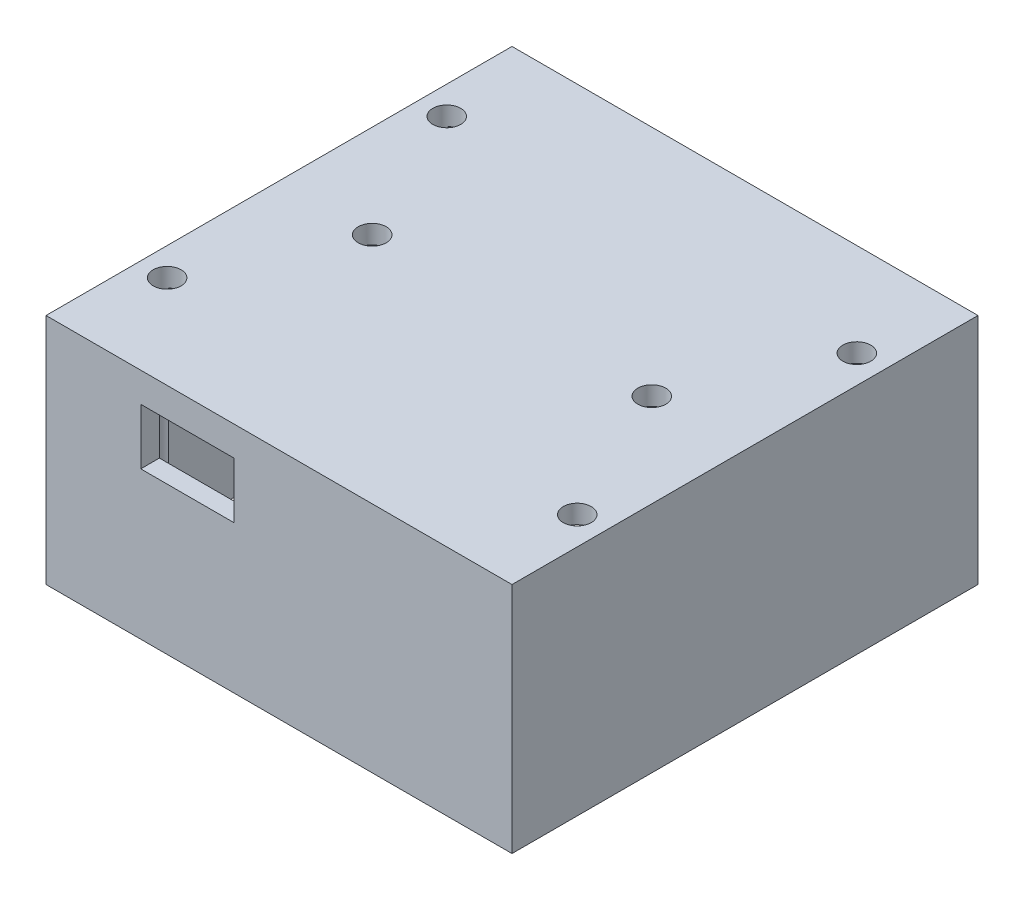
ISO-10303-21;
HEADER;
FILE_DESCRIPTION(('STEP AP214'),'2;1');
FILE_NAME('part.step','',(''),(''),'','','');
FILE_SCHEMA(('AUTOMOTIVE_DESIGN { 1 0 10303 214 1 1 1 1 }'));
ENDSEC;
DATA;
#1=APPLICATION_CONTEXT('core data for automotive mechanical design processes');
#2=APPLICATION_PROTOCOL_DEFINITION('international standard','automotive_design',2000,#1);
#3=PRODUCT_CONTEXT('',#1,'mechanical');
#4=PRODUCT('Part','Part','',(#3));
#5=PRODUCT_RELATED_PRODUCT_CATEGORY('part','',(#4));
#6=PRODUCT_DEFINITION_FORMATION('','',#4);
#7=PRODUCT_DEFINITION_CONTEXT('part definition',#1,'design');
#8=PRODUCT_DEFINITION('design','',#6,#7);
#9=PRODUCT_DEFINITION_SHAPE('','',#8);
#10=(LENGTH_UNIT() NAMED_UNIT(*) SI_UNIT(.MILLI.,.METRE.));
#11=(NAMED_UNIT(*) PLANE_ANGLE_UNIT() SI_UNIT($,.RADIAN.));
#12=(NAMED_UNIT(*) SI_UNIT($,.STERADIAN.) SOLID_ANGLE_UNIT());
#13=UNCERTAINTY_MEASURE_WITH_UNIT(LENGTH_MEASURE(1.E-05),#10,'distance_accuracy_value','');
#14=(GEOMETRIC_REPRESENTATION_CONTEXT(3) GLOBAL_UNCERTAINTY_ASSIGNED_CONTEXT((#13)) GLOBAL_UNIT_ASSIGNED_CONTEXT((#10,
#11,#12)) REPRESENTATION_CONTEXT('',''));
#15=CARTESIAN_POINT('',(0.,0.,0.));
#16=DIRECTION('',(0.,0.,1.));
#17=DIRECTION('',(1.,0.,0.));
#18=AXIS2_PLACEMENT_3D('',#15,#16,#17);
#19=CARTESIAN_POINT('',(23.,25.,-25.));
#20=DIRECTION('',(-1.,0.,0.));
#21=DIRECTION('',(0.,0.,1.));
#22=AXIS2_PLACEMENT_3D('',#19,#20,#21);
#23=PLANE('',#22);
#24=DIRECTION('',(0.,1.,0.));
#25=VECTOR('',#24,1.);
#26=CARTESIAN_POINT('',(23.,0.,-13.8819660112501));
#27=LINE('',#26,#25);
#28=CARTESIAN_POINT('',(23.,0.,-13.8819660112501));
#29=VERTEX_POINT('',#28);
#30=CARTESIAN_POINT('',(23.,23.,-13.8819660112501));
#31=VERTEX_POINT('',#30);
#32=EDGE_CURVE('E270',#29,#31,#27,.T.);
#33=ORIENTED_EDGE('',*,*,#32,.F.);
#34=DIRECTION('',(0.,0.,-1.));
#35=VECTOR('',#34,1.);
#36=CARTESIAN_POINT('',(23.,0.,-25.));
#37=LINE('',#36,#35);
#38=CARTESIAN_POINT('',(23.,0.,13.8819660112502));
#39=VERTEX_POINT('',#38);
#40=EDGE_CURVE('E294',#39,#29,#37,.T.);
#41=ORIENTED_EDGE('',*,*,#40,.F.);
#42=DIRECTION('',(0.,1.,0.));
#43=VECTOR('',#42,1.);
#44=CARTESIAN_POINT('',(23.,0.,13.8819660112502));
#45=LINE('',#44,#43);
#46=CARTESIAN_POINT('',(23.,23.,13.8819660112502));
#47=VERTEX_POINT('',#46);
#48=EDGE_CURVE('E188',#47,#39,#45,.F.);
#49=ORIENTED_EDGE('',*,*,#48,.F.);
#50=DIRECTION('',(0.,0.,-1.));
#51=VECTOR('',#50,1.);
#52=CARTESIAN_POINT('',(23.,23.,-25.));
#53=LINE('',#52,#51);
#54=EDGE_CURVE('E261',#47,#31,#53,.T.);
#55=ORIENTED_EDGE('',*,*,#54,.T.);
#56=EDGE_LOOP('',(#33,#41,#49,#55));
#57=FACE_BOUND('',#56,.T.);
#58=ADVANCED_FACE('F34',(#57),#23,.T.);
#59=DIRECTION('',(0.,1.,0.));
#60=VECTOR('',#59,1.);
#61=CARTESIAN_POINT('',(23.,0.,16.1180339887498));
#62=LINE('',#61,#60);
#63=CARTESIAN_POINT('',(23.,0.,16.1180339887498));
#64=VERTEX_POINT('',#63);
#65=CARTESIAN_POINT('',(23.,23.,16.1180339887498));
#66=VERTEX_POINT('',#65);
#67=EDGE_CURVE('E339',#64,#66,#62,.T.);
#68=ORIENTED_EDGE('',*,*,#67,.F.);
#69=CARTESIAN_POINT('',(23.,0.,23.));
#70=VERTEX_POINT('',#69);
#71=EDGE_CURVE('E205',#70,#64,#37,.T.);
#72=ORIENTED_EDGE('',*,*,#71,.F.);
#73=DIRECTION('',(0.,-1.,0.));
#74=VECTOR('',#73,1.);
#75=CARTESIAN_POINT('',(23.,25.,23.));
#76=LINE('',#75,#74);
#77=CARTESIAN_POINT('',(23.,23.,23.));
#78=VERTEX_POINT('',#77);
#79=EDGE_CURVE('E279',#78,#70,#76,.T.);
#80=ORIENTED_EDGE('',*,*,#79,.F.);
#81=EDGE_CURVE('E272',#78,#66,#53,.T.);
#82=ORIENTED_EDGE('',*,*,#81,.T.);
#83=EDGE_LOOP('',(#68,#72,#80,#82));
#84=FACE_BOUND('',#83,.T.);
#85=ADVANCED_FACE('F397',(#84),#23,.T.);
#86=CARTESIAN_POINT('',(-23.,25.,-25.));
#87=DIRECTION('',(1.,0.,0.));
#88=DIRECTION('',(0.,0.,-1.));
#89=AXIS2_PLACEMENT_3D('',#86,#87,#88);
#90=PLANE('',#89);
#91=DIRECTION('',(0.,1.,0.));
#92=VECTOR('',#91,1.);
#93=CARTESIAN_POINT('',(-23.,0.,-16.1180339887499));
#94=LINE('',#93,#92);
#95=CARTESIAN_POINT('',(-23.,0.,-16.1180339887499));
#96=VERTEX_POINT('',#95);
#97=CARTESIAN_POINT('',(-23.,23.,-16.1180339887499));
#98=VERTEX_POINT('',#97);
#99=EDGE_CURVE('E58',#96,#98,#94,.T.);
#100=ORIENTED_EDGE('',*,*,#99,.F.);
#101=DIRECTION('',(0.,0.,1.));
#102=VECTOR('',#101,1.);
#103=CARTESIAN_POINT('',(-23.,0.,-25.));
#104=LINE('',#103,#102);
#105=CARTESIAN_POINT('',(-23.,0.,-23.));
#106=VERTEX_POINT('',#105);
#107=EDGE_CURVE('E195',#106,#96,#104,.T.);
#108=ORIENTED_EDGE('',*,*,#107,.F.);
#109=DIRECTION('',(0.,-1.,0.));
#110=VECTOR('',#109,1.);
#111=CARTESIAN_POINT('',(-23.,25.,-23.));
#112=LINE('',#111,#110);
#113=CARTESIAN_POINT('',(-23.,23.,-23.));
#114=VERTEX_POINT('',#113);
#115=EDGE_CURVE('E283',#114,#106,#112,.T.);
#116=ORIENTED_EDGE('',*,*,#115,.F.);
#117=DIRECTION('',(0.,0.,1.));
#118=VECTOR('',#117,1.);
#119=CARTESIAN_POINT('',(-23.,23.,-25.));
#120=LINE('',#119,#118);
#121=EDGE_CURVE('E290',#114,#98,#120,.T.);
#122=ORIENTED_EDGE('',*,*,#121,.T.);
#123=EDGE_LOOP('',(#100,#108,#116,#122));
#124=FACE_BOUND('',#123,.T.);
#125=ADVANCED_FACE('F403',(#124),#90,.T.);
#126=DIRECTION('',(0.,1.,0.));
#127=VECTOR('',#126,1.);
#128=CARTESIAN_POINT('',(-23.,0.,-13.8819660112501));
#129=LINE('',#128,#127);
#130=CARTESIAN_POINT('',(-23.,23.,-13.8819660112501));
#131=VERTEX_POINT('',#130);
#132=CARTESIAN_POINT('',(-23.,0.,-13.8819660112501));
#133=VERTEX_POINT('',#132);
#134=EDGE_CURVE('E334',#131,#133,#129,.F.);
#135=ORIENTED_EDGE('',*,*,#134,.F.);
#136=CARTESIAN_POINT('',(-23.,23.,13.8819660112501));
#137=VERTEX_POINT('',#136);
#138=EDGE_CURVE('E187',#131,#137,#120,.T.);
#139=ORIENTED_EDGE('',*,*,#138,.T.);
#140=DIRECTION('',(0.,1.,0.));
#141=VECTOR('',#140,1.);
#142=CARTESIAN_POINT('',(-23.,0.,13.8819660112501));
#143=LINE('',#142,#141);
#144=CARTESIAN_POINT('',(-23.,0.,13.8819660112501));
#145=VERTEX_POINT('',#144);
#146=EDGE_CURVE('E50',#145,#137,#143,.T.);
#147=ORIENTED_EDGE('',*,*,#146,.F.);
#148=EDGE_CURVE('E185',#133,#145,#104,.T.);
#149=ORIENTED_EDGE('',*,*,#148,.F.);
#150=EDGE_LOOP('',(#135,#139,#147,#149));
#151=FACE_BOUND('',#150,.T.);
#152=ADVANCED_FACE('F184',(#151),#90,.T.);
#153=CARTESIAN_POINT('',(25.,25.,-25.));
#154=DIRECTION('',(-1.,0.,0.));
#155=DIRECTION('',(0.,0.,1.));
#156=AXIS2_PLACEMENT_3D('',#153,#154,#155);
#157=PLANE('',#156);
#158=DIRECTION('',(0.,0.,-1.));
#159=VECTOR('',#158,1.);
#160=CARTESIAN_POINT('',(25.,0.,-25.));
#161=LINE('',#160,#159);
#162=CARTESIAN_POINT('',(25.,0.,25.));
#163=VERTEX_POINT('',#162);
#164=CARTESIAN_POINT('',(25.,0.,-25.));
#165=VERTEX_POINT('',#164);
#166=EDGE_CURVE('E217',#163,#165,#161,.T.);
#167=ORIENTED_EDGE('',*,*,#166,.T.);
#168=DIRECTION('',(0.,-1.,0.));
#169=VECTOR('',#168,1.);
#170=CARTESIAN_POINT('',(25.,25.,-25.));
#171=LINE('',#170,#169);
#172=CARTESIAN_POINT('',(25.,25.,-25.));
#173=VERTEX_POINT('',#172);
#174=EDGE_CURVE('E234',#173,#165,#171,.T.);
#175=ORIENTED_EDGE('',*,*,#174,.F.);
#176=DIRECTION('',(0.,0.,-1.));
#177=VECTOR('',#176,1.);
#178=CARTESIAN_POINT('',(25.,25.,-25.));
#179=LINE('',#178,#177);
#180=CARTESIAN_POINT('',(25.,25.,25.));
#181=VERTEX_POINT('',#180);
#182=EDGE_CURVE('E206',#181,#173,#179,.T.);
#183=ORIENTED_EDGE('',*,*,#182,.F.);
#184=DIRECTION('',(0.,-1.,0.));
#185=VECTOR('',#184,1.);
#186=CARTESIAN_POINT('',(25.,25.,25.));
#187=LINE('',#186,#185);
#188=EDGE_CURVE('E216',#181,#163,#187,.T.);
#189=ORIENTED_EDGE('',*,*,#188,.T.);
#190=EDGE_LOOP('',(#167,#175,#183,#189));
#191=FACE_BOUND('',#190,.T.);
#192=ADVANCED_FACE('F36',(#191),#157,.F.);
#193=CARTESIAN_POINT('',(-25.,25.,-25.));
#194=DIRECTION('',(0.,0.,1.));
#195=DIRECTION('',(1.,0.,0.));
#196=AXIS2_PLACEMENT_3D('',#193,#194,#195);
#197=PLANE('',#196);
#198=DIRECTION('',(-1.,0.,0.));
#199=VECTOR('',#198,1.);
#200=CARTESIAN_POINT('',(-25.,0.,-25.));
#201=LINE('',#200,#199);
#202=CARTESIAN_POINT('',(-25.,0.,-25.));
#203=VERTEX_POINT('',#202);
#204=EDGE_CURVE('E220',#165,#203,#201,.T.);
#205=ORIENTED_EDGE('',*,*,#204,.T.);
#206=DIRECTION('',(0.,-1.,0.));
#207=VECTOR('',#206,1.);
#208=CARTESIAN_POINT('',(-25.,25.,-25.));
#209=LINE('',#208,#207);
#210=CARTESIAN_POINT('',(-25.,25.,-25.));
#211=VERTEX_POINT('',#210);
#212=EDGE_CURVE('E231',#211,#203,#209,.T.);
#213=ORIENTED_EDGE('',*,*,#212,.F.);
#214=DIRECTION('',(-1.,0.,0.));
#215=VECTOR('',#214,1.);
#216=CARTESIAN_POINT('',(-25.,25.,-25.));
#217=LINE('',#216,#215);
#218=EDGE_CURVE('E209',#173,#211,#217,.T.);
#219=ORIENTED_EDGE('',*,*,#218,.F.);
#220=ORIENTED_EDGE('',*,*,#174,.T.);
#221=EDGE_LOOP('',(#205,#213,#219,#220));
#222=FACE_BOUND('',#221,.T.);
#223=ADVANCED_FACE('F380',(#222),#197,.F.);
#224=CARTESIAN_POINT('',(-25.,25.,-25.));
#225=DIRECTION('',(1.,0.,0.));
#226=DIRECTION('',(0.,0.,-1.));
#227=AXIS2_PLACEMENT_3D('',#224,#225,#226);
#228=PLANE('',#227);
#229=DIRECTION('',(0.,0.,1.));
#230=VECTOR('',#229,1.);
#231=CARTESIAN_POINT('',(-25.,0.,-25.));
#232=LINE('',#231,#230);
#233=CARTESIAN_POINT('',(-25.,0.,25.));
#234=VERTEX_POINT('',#233);
#235=EDGE_CURVE('E223',#203,#234,#232,.T.);
#236=ORIENTED_EDGE('',*,*,#235,.T.);
#237=DIRECTION('',(0.,-1.,0.));
#238=VECTOR('',#237,1.);
#239=CARTESIAN_POINT('',(-25.,25.,25.));
#240=LINE('',#239,#238);
#241=CARTESIAN_POINT('',(-25.,25.,25.));
#242=VERTEX_POINT('',#241);
#243=EDGE_CURVE('E228',#242,#234,#240,.T.);
#244=ORIENTED_EDGE('',*,*,#243,.F.);
#245=DIRECTION('',(0.,0.,1.));
#246=VECTOR('',#245,1.);
#247=CARTESIAN_POINT('',(-25.,25.,-25.));
#248=LINE('',#247,#246);
#249=EDGE_CURVE('E212',#211,#242,#248,.T.);
#250=ORIENTED_EDGE('',*,*,#249,.F.);
#251=ORIENTED_EDGE('',*,*,#212,.T.);
#252=EDGE_LOOP('',(#236,#244,#250,#251));
#253=FACE_BOUND('',#252,.T.);
#254=ADVANCED_FACE('F385',(#253),#228,.F.);
#255=CARTESIAN_POINT('',(-25.,25.,25.));
#256=DIRECTION('',(0.,0.,-1.));
#257=DIRECTION('',(-1.,0.,0.));
#258=AXIS2_PLACEMENT_3D('',#255,#256,#257);
#259=PLANE('',#258);
#260=DIRECTION('',(-1.,0.,0.));
#261=VECTOR('',#260,1.);
#262=CARTESIAN_POINT('',(-14.8335821112489,21.831840126127,25.));
#263=LINE('',#262,#261);
#264=CARTESIAN_POINT('',(-4.83358211124892,21.831840126127,25.));
#265=VERTEX_POINT('',#264);
#266=CARTESIAN_POINT('',(-14.8335821112489,21.831840126127,25.));
#267=VERTEX_POINT('',#266);
#268=EDGE_CURVE('E325',#265,#267,#263,.T.);
#269=ORIENTED_EDGE('',*,*,#268,.F.);
#270=DIRECTION('',(0.,1.,0.));
#271=VECTOR('',#270,1.);
#272=CARTESIAN_POINT('',(-4.83358211124892,21.831840126127,25.));
#273=LINE('',#272,#271);
#274=CARTESIAN_POINT('',(-4.83358211124892,15.831840126127,25.));
#275=VERTEX_POINT('',#274);
#276=EDGE_CURVE('E329',#275,#265,#273,.T.);
#277=ORIENTED_EDGE('',*,*,#276,.F.);
#278=DIRECTION('',(1.,0.,0.));
#279=VECTOR('',#278,1.);
#280=CARTESIAN_POINT('',(-14.8335821112489,15.831840126127,25.));
#281=LINE('',#280,#279);
#282=CARTESIAN_POINT('',(-14.8335821112489,15.831840126127,25.));
#283=VERTEX_POINT('',#282);
#284=EDGE_CURVE('E311',#283,#275,#281,.T.);
#285=ORIENTED_EDGE('',*,*,#284,.F.);
#286=DIRECTION('',(0.,-1.,0.));
#287=VECTOR('',#286,1.);
#288=CARTESIAN_POINT('',(-14.8335821112489,21.831840126127,25.));
#289=LINE('',#288,#287);
#290=EDGE_CURVE('E320',#267,#283,#289,.T.);
#291=ORIENTED_EDGE('',*,*,#290,.F.);
#292=EDGE_LOOP('',(#269,#277,#285,#291));
#293=FACE_BOUND('',#292,.T.);
#294=DIRECTION('',(1.,0.,0.));
#295=VECTOR('',#294,1.);
#296=CARTESIAN_POINT('',(-25.,0.,25.));
#297=LINE('',#296,#295);
#298=EDGE_CURVE('E210',#234,#163,#297,.T.);
#299=ORIENTED_EDGE('',*,*,#298,.T.);
#300=ORIENTED_EDGE('',*,*,#188,.F.);
#301=DIRECTION('',(1.,0.,0.));
#302=VECTOR('',#301,1.);
#303=CARTESIAN_POINT('',(-25.,25.,25.));
#304=LINE('',#303,#302);
#305=EDGE_CURVE('E214',#242,#181,#304,.T.);
#306=ORIENTED_EDGE('',*,*,#305,.F.);
#307=ORIENTED_EDGE('',*,*,#243,.T.);
#308=EDGE_LOOP('',(#299,#300,#306,#307));
#309=FACE_BOUND('',#308,.T.);
#310=ADVANCED_FACE('F367',(#293,#309),#259,.F.);
#311=CARTESIAN_POINT('',(0.,25.,0.));
#312=DIRECTION('',(0.,1.,0.));
#313=DIRECTION('',(0.,0.,1.));
#314=AXIS2_PLACEMENT_3D('',#311,#312,#313);
#315=PLANE('',#314);
#316=CARTESIAN_POINT('',(-15.,25.,0.));
#317=DIRECTION('',(0.,1.,0.));
#318=DIRECTION('',(0.,0.,-1.));
#319=AXIS2_PLACEMENT_3D('',#316,#317,#318);
#320=CIRCLE('',#319,1.5);
#321=CARTESIAN_POINT('',(-15.,25.,-1.5));
#322=VERTEX_POINT('',#321);
#323=EDGE_CURVE('E345',#322,#322,#320,.T.);
#324=ORIENTED_EDGE('',*,*,#323,.F.);
#325=EDGE_LOOP('',(#324));
#326=FACE_BOUND('',#325,.T.);
#327=CARTESIAN_POINT('',(-22.,25.,-15.));
#328=DIRECTION('',(0.,1.,0.));
#329=DIRECTION('',(0.,0.,1.));
#330=AXIS2_PLACEMENT_3D('',#327,#328,#329);
#331=CIRCLE('',#330,1.5);
#332=CARTESIAN_POINT('',(-22.,25.,-13.5));
#333=VERTEX_POINT('',#332);
#334=EDGE_CURVE('E355',#333,#333,#331,.T.);
#335=ORIENTED_EDGE('',*,*,#334,.F.);
#336=EDGE_LOOP('',(#335));
#337=FACE_BOUND('',#336,.T.);
#338=CARTESIAN_POINT('',(22.,25.,-15.));
#339=DIRECTION('',(0.,1.,0.));
#340=DIRECTION('',(0.,0.,-1.));
#341=AXIS2_PLACEMENT_3D('',#338,#339,#340);
#342=CIRCLE('',#341,1.5);
#343=CARTESIAN_POINT('',(22.,25.,-16.5));
#344=VERTEX_POINT('',#343);
#345=EDGE_CURVE('E350',#344,#344,#342,.T.);
#346=ORIENTED_EDGE('',*,*,#345,.F.);
#347=EDGE_LOOP('',(#346));
#348=FACE_BOUND('',#347,.T.);
#349=CARTESIAN_POINT('',(21.9999999999999,25.,15.));
#350=DIRECTION('',(0.,1.,0.));
#351=DIRECTION('',(0.,0.,1.));
#352=AXIS2_PLACEMENT_3D('',#349,#350,#351);
#353=CIRCLE('',#352,1.5);
#354=CARTESIAN_POINT('',(21.9999999999999,25.,16.5));
#355=VERTEX_POINT('',#354);
#356=EDGE_CURVE('E177',#355,#355,#353,.T.);
#357=ORIENTED_EDGE('',*,*,#356,.F.);
#358=EDGE_LOOP('',(#357));
#359=FACE_BOUND('',#358,.T.);
#360=CARTESIAN_POINT('',(-22.,25.,15.));
#361=DIRECTION('',(0.,1.,0.));
#362=DIRECTION('',(0.,0.,-1.));
#363=AXIS2_PLACEMENT_3D('',#360,#361,#362);
#364=CIRCLE('',#363,1.5);
#365=CARTESIAN_POINT('',(-22.,25.,13.5));
#366=VERTEX_POINT('',#365);
#367=EDGE_CURVE('E178',#366,#366,#364,.T.);
#368=ORIENTED_EDGE('',*,*,#367,.F.);
#369=EDGE_LOOP('',(#368));
#370=FACE_BOUND('',#369,.T.);
#371=CARTESIAN_POINT('',(15.,25.,0.));
#372=DIRECTION('',(0.,1.,0.));
#373=DIRECTION('',(0.,0.,1.));
#374=AXIS2_PLACEMENT_3D('',#371,#372,#373);
#375=CIRCLE('',#374,1.5);
#376=CARTESIAN_POINT('',(15.,25.,1.5));
#377=VERTEX_POINT('',#376);
#378=EDGE_CURVE('E250',#377,#377,#375,.T.);
#379=ORIENTED_EDGE('',*,*,#378,.F.);
#380=EDGE_LOOP('',(#379));
#381=FACE_BOUND('',#380,.T.);
#382=ORIENTED_EDGE('',*,*,#182,.T.);
#383=ORIENTED_EDGE('',*,*,#218,.T.);
#384=ORIENTED_EDGE('',*,*,#249,.T.);
#385=ORIENTED_EDGE('',*,*,#305,.T.);
#386=EDGE_LOOP('',(#382,#383,#384,#385));
#387=FACE_BOUND('',#386,.T.);
#388=ADVANCED_FACE('F364',(#326,#337,#348,#359,#370,#381,#387),#315,.T.);
#389=CARTESIAN_POINT('',(0.,0.,0.));
#390=DIRECTION('',(0.,1.,0.));
#391=DIRECTION('',(0.,0.,1.));
#392=AXIS2_PLACEMENT_3D('',#389,#390,#391);
#393=PLANE('',#392);
#394=ORIENTED_EDGE('',*,*,#107,.T.);
#395=CARTESIAN_POINT('',(-22.,0.,-15.));
#396=DIRECTION('',(0.,1.,0.));
#397=DIRECTION('',(0.,0.,1.));
#398=AXIS2_PLACEMENT_3D('',#395,#396,#397);
#399=CIRCLE('',#398,1.5);
#400=EDGE_CURVE('E194',#96,#133,#399,.T.);
#401=ORIENTED_EDGE('',*,*,#400,.T.);
#402=ORIENTED_EDGE('',*,*,#148,.T.);
#403=CARTESIAN_POINT('',(-22.,0.,15.));
#404=DIRECTION('',(0.,1.,0.));
#405=DIRECTION('',(0.,0.,-1.));
#406=AXIS2_PLACEMENT_3D('',#403,#404,#405);
#407=CIRCLE('',#406,1.5);
#408=CARTESIAN_POINT('',(-23.,0.,16.1180339887499));
#409=VERTEX_POINT('',#408);
#410=EDGE_CURVE('E169',#145,#409,#407,.T.);
#411=ORIENTED_EDGE('',*,*,#410,.T.);
#412=CARTESIAN_POINT('',(-23.,0.,23.));
#413=VERTEX_POINT('',#412);
#414=EDGE_CURVE('E196',#409,#413,#104,.T.);
#415=ORIENTED_EDGE('',*,*,#414,.T.);
#416=DIRECTION('',(1.,0.,0.));
#417=VECTOR('',#416,1.);
#418=CARTESIAN_POINT('',(-25.,0.,23.));
#419=LINE('',#418,#417);
#420=EDGE_CURVE('E198',#413,#70,#419,.T.);
#421=ORIENTED_EDGE('',*,*,#420,.T.);
#422=ORIENTED_EDGE('',*,*,#71,.T.);
#423=CARTESIAN_POINT('',(21.9999999999999,0.,15.));
#424=DIRECTION('',(0.,1.,0.));
#425=DIRECTION('',(0.,0.,1.));
#426=AXIS2_PLACEMENT_3D('',#423,#424,#425);
#427=CIRCLE('',#426,1.5);
#428=EDGE_CURVE('E348',#64,#39,#427,.T.);
#429=ORIENTED_EDGE('',*,*,#428,.T.);
#430=ORIENTED_EDGE('',*,*,#40,.T.);
#431=CARTESIAN_POINT('',(22.,0.,-15.));
#432=DIRECTION('',(0.,1.,0.));
#433=DIRECTION('',(0.,0.,-1.));
#434=AXIS2_PLACEMENT_3D('',#431,#432,#433);
#435=CIRCLE('',#434,1.5);
#436=CARTESIAN_POINT('',(23.,0.,-16.1180339887499));
#437=VERTEX_POINT('',#436);
#438=EDGE_CURVE('E353',#29,#437,#435,.T.);
#439=ORIENTED_EDGE('',*,*,#438,.T.);
#440=CARTESIAN_POINT('',(23.,0.,-23.));
#441=VERTEX_POINT('',#440);
#442=EDGE_CURVE('E295',#437,#441,#37,.T.);
#443=ORIENTED_EDGE('',*,*,#442,.T.);
#444=DIRECTION('',(-1.,0.,0.));
#445=VECTOR('',#444,1.);
#446=CARTESIAN_POINT('',(-25.,0.,-23.));
#447=LINE('',#446,#445);
#448=EDGE_CURVE('E199',#441,#106,#447,.T.);
#449=ORIENTED_EDGE('',*,*,#448,.T.);
#450=EDGE_LOOP('',(#394,#401,#402,#411,#415,#421,#422,#429,#430,#439,#443,#449));
#451=FACE_BOUND('',#450,.T.);
#452=ORIENTED_EDGE('',*,*,#166,.F.);
#453=ORIENTED_EDGE('',*,*,#298,.F.);
#454=ORIENTED_EDGE('',*,*,#235,.F.);
#455=ORIENTED_EDGE('',*,*,#204,.F.);
#456=EDGE_LOOP('',(#452,#453,#454,#455));
#457=FACE_BOUND('',#456,.T.);
#458=ADVANCED_FACE('F192',(#451,#457),#393,.F.);
#459=DIRECTION('',(0.,1.,0.));
#460=VECTOR('',#459,1.);
#461=CARTESIAN_POINT('',(23.,0.,-16.1180339887499));
#462=LINE('',#461,#460);
#463=CARTESIAN_POINT('',(23.,23.,-16.1180339887499));
#464=VERTEX_POINT('',#463);
#465=EDGE_CURVE('E337',#464,#437,#462,.F.);
#466=ORIENTED_EDGE('',*,*,#465,.F.);
#467=CARTESIAN_POINT('',(23.,23.,-23.));
#468=VERTEX_POINT('',#467);
#469=EDGE_CURVE('E263',#464,#468,#53,.T.);
#470=ORIENTED_EDGE('',*,*,#469,.T.);
#471=DIRECTION('',(0.,-1.,0.));
#472=VECTOR('',#471,1.);
#473=CARTESIAN_POINT('',(23.,25.,-23.));
#474=LINE('',#473,#472);
#475=EDGE_CURVE('E221',#468,#441,#474,.T.);
#476=ORIENTED_EDGE('',*,*,#475,.T.);
#477=ORIENTED_EDGE('',*,*,#442,.F.);
#478=EDGE_LOOP('',(#466,#470,#476,#477));
#479=FACE_BOUND('',#478,.T.);
#480=ADVANCED_FACE('F389',(#479),#23,.T.);
#481=CARTESIAN_POINT('',(-25.,25.,-23.));
#482=DIRECTION('',(0.,0.,1.));
#483=DIRECTION('',(1.,0.,0.));
#484=AXIS2_PLACEMENT_3D('',#481,#482,#483);
#485=PLANE('',#484);
#486=ORIENTED_EDGE('',*,*,#448,.F.);
#487=ORIENTED_EDGE('',*,*,#475,.F.);
#488=DIRECTION('',(-1.,0.,0.));
#489=VECTOR('',#488,1.);
#490=CARTESIAN_POINT('',(-25.,23.,-23.));
#491=LINE('',#490,#489);
#492=EDGE_CURVE('E275',#468,#114,#491,.T.);
#493=ORIENTED_EDGE('',*,*,#492,.T.);
#494=ORIENTED_EDGE('',*,*,#115,.T.);
#495=EDGE_LOOP('',(#486,#487,#493,#494));
#496=FACE_BOUND('',#495,.T.);
#497=ADVANCED_FACE('F394',(#496),#485,.T.);
#498=DIRECTION('',(0.,1.,0.));
#499=VECTOR('',#498,1.);
#500=CARTESIAN_POINT('',(-23.,0.,16.1180339887499));
#501=LINE('',#500,#499);
#502=CARTESIAN_POINT('',(-23.,23.,16.1180339887499));
#503=VERTEX_POINT('',#502);
#504=EDGE_CURVE('E173',#503,#409,#501,.F.);
#505=ORIENTED_EDGE('',*,*,#504,.F.);
#506=CARTESIAN_POINT('',(-23.,23.,23.));
#507=VERTEX_POINT('',#506);
#508=EDGE_CURVE('E287',#503,#507,#120,.T.);
#509=ORIENTED_EDGE('',*,*,#508,.T.);
#510=DIRECTION('',(0.,-1.,0.));
#511=VECTOR('',#510,1.);
#512=CARTESIAN_POINT('',(-23.,25.,23.));
#513=LINE('',#512,#511);
#514=EDGE_CURVE('E281',#507,#413,#513,.T.);
#515=ORIENTED_EDGE('',*,*,#514,.T.);
#516=ORIENTED_EDGE('',*,*,#414,.F.);
#517=EDGE_LOOP('',(#505,#509,#515,#516));
#518=FACE_BOUND('',#517,.T.);
#519=ADVANCED_FACE('F411',(#518),#90,.T.);
#520=CARTESIAN_POINT('',(-25.,25.,23.));
#521=DIRECTION('',(0.,0.,-1.));
#522=DIRECTION('',(-1.,0.,0.));
#523=AXIS2_PLACEMENT_3D('',#520,#521,#522);
#524=PLANE('',#523);
#525=DIRECTION('',(0.,-1.,0.));
#526=VECTOR('',#525,1.);
#527=CARTESIAN_POINT('',(-4.83358211124892,25.,23.));
#528=LINE('',#527,#526);
#529=CARTESIAN_POINT('',(-4.83358211124892,21.831840126127,23.));
#530=VERTEX_POINT('',#529);
#531=CARTESIAN_POINT('',(-4.83358211124892,15.831840126127,23.));
#532=VERTEX_POINT('',#531);
#533=EDGE_CURVE('E244',#530,#532,#528,.T.);
#534=ORIENTED_EDGE('',*,*,#533,.F.);
#535=DIRECTION('',(1.,0.,0.));
#536=VECTOR('',#535,1.);
#537=CARTESIAN_POINT('',(-25.,21.831840126127,23.));
#538=LINE('',#537,#536);
#539=CARTESIAN_POINT('',(-14.8335821112489,21.831840126127,23.));
#540=VERTEX_POINT('',#539);
#541=EDGE_CURVE('E237',#540,#530,#538,.T.);
#542=ORIENTED_EDGE('',*,*,#541,.F.);
#543=DIRECTION('',(0.,1.,0.));
#544=VECTOR('',#543,1.);
#545=CARTESIAN_POINT('',(-14.8335821112489,25.,23.));
#546=LINE('',#545,#544);
#547=CARTESIAN_POINT('',(-14.8335821112489,15.831840126127,23.));
#548=VERTEX_POINT('',#547);
#549=EDGE_CURVE('E239',#548,#540,#546,.T.);
#550=ORIENTED_EDGE('',*,*,#549,.F.);
#551=DIRECTION('',(-1.,0.,0.));
#552=VECTOR('',#551,1.);
#553=CARTESIAN_POINT('',(-25.,15.831840126127,23.));
#554=LINE('',#553,#552);
#555=EDGE_CURVE('E242',#532,#548,#554,.T.);
#556=ORIENTED_EDGE('',*,*,#555,.F.);
#557=EDGE_LOOP('',(#534,#542,#550,#556));
#558=FACE_BOUND('',#557,.T.);
#559=ORIENTED_EDGE('',*,*,#420,.F.);
#560=ORIENTED_EDGE('',*,*,#514,.F.);
#561=DIRECTION('',(1.,0.,0.));
#562=VECTOR('',#561,1.);
#563=CARTESIAN_POINT('',(-25.,23.,23.));
#564=LINE('',#563,#562);
#565=EDGE_CURVE('E282',#507,#78,#564,.T.);
#566=ORIENTED_EDGE('',*,*,#565,.T.);
#567=ORIENTED_EDGE('',*,*,#79,.T.);
#568=EDGE_LOOP('',(#559,#560,#566,#567));
#569=FACE_BOUND('',#568,.T.);
#570=ADVANCED_FACE('F415',(#558,#569),#524,.T.);
#571=CARTESIAN_POINT('',(0.,23.,0.));
#572=DIRECTION('',(0.,1.,0.));
#573=DIRECTION('',(0.,0.,1.));
#574=AXIS2_PLACEMENT_3D('',#571,#572,#573);
#575=PLANE('',#574);
#576=CARTESIAN_POINT('',(-15.,23.,0.));
#577=DIRECTION('',(0.,1.,0.));
#578=DIRECTION('',(0.,0.,1.));
#579=AXIS2_PLACEMENT_3D('',#576,#577,#578);
#580=CIRCLE('',#579,1.5);
#581=CARTESIAN_POINT('',(-15.,23.,1.5));
#582=VERTEX_POINT('',#581);
#583=EDGE_CURVE('E38',#582,#582,#580,.T.);
#584=ORIENTED_EDGE('',*,*,#583,.T.);
#585=EDGE_LOOP('',(#584));
#586=FACE_BOUND('',#585,.T.);
#587=CARTESIAN_POINT('',(15.,23.,0.));
#588=DIRECTION('',(0.,1.,0.));
#589=DIRECTION('',(0.,0.,1.));
#590=AXIS2_PLACEMENT_3D('',#587,#588,#589);
#591=CIRCLE('',#590,1.5);
#592=CARTESIAN_POINT('',(15.,23.,1.5));
#593=VERTEX_POINT('',#592);
#594=EDGE_CURVE('E247',#593,#593,#591,.T.);
#595=ORIENTED_EDGE('',*,*,#594,.T.);
#596=EDGE_LOOP('',(#595));
#597=FACE_BOUND('',#596,.T.);
#598=ORIENTED_EDGE('',*,*,#138,.F.);
#599=CARTESIAN_POINT('',(-22.,23.,-15.));
#600=DIRECTION('',(0.,1.,0.));
#601=DIRECTION('',(0.,0.,1.));
#602=AXIS2_PLACEMENT_3D('',#599,#600,#601);
#603=CIRCLE('',#602,1.5);
#604=EDGE_CURVE('E11',#131,#98,#603,.T.);
#605=ORIENTED_EDGE('',*,*,#604,.T.);
#606=ORIENTED_EDGE('',*,*,#121,.F.);
#607=ORIENTED_EDGE('',*,*,#492,.F.);
#608=ORIENTED_EDGE('',*,*,#469,.F.);
#609=CARTESIAN_POINT('',(22.,23.,-15.));
#610=DIRECTION('',(0.,1.,0.));
#611=DIRECTION('',(0.,0.,1.));
#612=AXIS2_PLACEMENT_3D('',#609,#610,#611);
#613=CIRCLE('',#612,1.5);
#614=EDGE_CURVE('E43',#464,#31,#613,.T.);
#615=ORIENTED_EDGE('',*,*,#614,.T.);
#616=ORIENTED_EDGE('',*,*,#54,.F.);
#617=CARTESIAN_POINT('',(21.9999999999999,23.,15.));
#618=DIRECTION('',(0.,1.,0.));
#619=DIRECTION('',(0.,0.,1.));
#620=AXIS2_PLACEMENT_3D('',#617,#618,#619);
#621=CIRCLE('',#620,1.5);
#622=EDGE_CURVE('E252',#47,#66,#621,.T.);
#623=ORIENTED_EDGE('',*,*,#622,.T.);
#624=ORIENTED_EDGE('',*,*,#81,.F.);
#625=ORIENTED_EDGE('',*,*,#565,.F.);
#626=ORIENTED_EDGE('',*,*,#508,.F.);
#627=CARTESIAN_POINT('',(-22.,23.,15.));
#628=DIRECTION('',(0.,1.,0.));
#629=DIRECTION('',(0.,0.,1.));
#630=AXIS2_PLACEMENT_3D('',#627,#628,#629);
#631=CIRCLE('',#630,1.5);
#632=EDGE_CURVE('E246',#503,#137,#631,.T.);
#633=ORIENTED_EDGE('',*,*,#632,.T.);
#634=EDGE_LOOP('',(#598,#605,#606,#607,#608,#615,#616,#623,#624,#625,#626,#633));
#635=FACE_BOUND('',#634,.T.);
#636=ADVANCED_FACE('F260',(#586,#597,#635),#575,.F.);
#637=CARTESIAN_POINT('',(-4.83358211124892,21.831840126127,13.));
#638=DIRECTION('',(1.,0.,0.));
#639=DIRECTION('',(0.,1.,0.));
#640=AXIS2_PLACEMENT_3D('',#637,#638,#639);
#641=PLANE('',#640);
#642=ORIENTED_EDGE('',*,*,#533,.T.);
#643=DIRECTION('',(0.,0.,1.));
#644=VECTOR('',#643,1.);
#645=CARTESIAN_POINT('',(-4.83358211124892,15.831840126127,13.));
#646=LINE('',#645,#644);
#647=EDGE_CURVE('E299',#532,#275,#646,.T.);
#648=ORIENTED_EDGE('',*,*,#647,.T.);
#649=ORIENTED_EDGE('',*,*,#276,.T.);
#650=DIRECTION('',(0.,0.,1.));
#651=VECTOR('',#650,1.);
#652=CARTESIAN_POINT('',(-4.83358211124892,21.831840126127,13.));
#653=LINE('',#652,#651);
#654=EDGE_CURVE('E314',#530,#265,#653,.T.);
#655=ORIENTED_EDGE('',*,*,#654,.F.);
#656=EDGE_LOOP('',(#642,#648,#649,#655));
#657=FACE_BOUND('',#656,.T.);
#658=ADVANCED_FACE('F407',(#657),#641,.F.);
#659=CARTESIAN_POINT('',(-14.8335821112489,15.831840126127,13.));
#660=DIRECTION('',(0.,-1.,0.));
#661=DIRECTION('',(0.,0.,-1.));
#662=AXIS2_PLACEMENT_3D('',#659,#660,#661);
#663=PLANE('',#662);
#664=ORIENTED_EDGE('',*,*,#555,.T.);
#665=DIRECTION('',(0.,0.,1.));
#666=VECTOR('',#665,1.);
#667=CARTESIAN_POINT('',(-14.8335821112489,15.831840126127,13.));
#668=LINE('',#667,#666);
#669=EDGE_CURVE('E303',#548,#283,#668,.T.);
#670=ORIENTED_EDGE('',*,*,#669,.T.);
#671=ORIENTED_EDGE('',*,*,#284,.T.);
#672=ORIENTED_EDGE('',*,*,#647,.F.);
#673=EDGE_LOOP('',(#664,#670,#671,#672));
#674=FACE_BOUND('',#673,.T.);
#675=ADVANCED_FACE('F425',(#674),#663,.F.);
#676=CARTESIAN_POINT('',(-14.8335821112489,21.831840126127,13.));
#677=DIRECTION('',(-1.,0.,0.));
#678=DIRECTION('',(0.,0.,1.));
#679=AXIS2_PLACEMENT_3D('',#676,#677,#678);
#680=PLANE('',#679);
#681=ORIENTED_EDGE('',*,*,#549,.T.);
#682=DIRECTION('',(0.,0.,1.));
#683=VECTOR('',#682,1.);
#684=CARTESIAN_POINT('',(-14.8335821112489,21.831840126127,13.));
#685=LINE('',#684,#683);
#686=EDGE_CURVE('E308',#540,#267,#685,.T.);
#687=ORIENTED_EDGE('',*,*,#686,.T.);
#688=ORIENTED_EDGE('',*,*,#290,.T.);
#689=ORIENTED_EDGE('',*,*,#669,.F.);
#690=EDGE_LOOP('',(#681,#687,#688,#689));
#691=FACE_BOUND('',#690,.T.);
#692=ADVANCED_FACE('F442',(#691),#680,.F.);
#693=CARTESIAN_POINT('',(-14.8335821112489,21.831840126127,13.));
#694=DIRECTION('',(0.,1.,0.));
#695=DIRECTION('',(0.,0.,1.));
#696=AXIS2_PLACEMENT_3D('',#693,#694,#695);
#697=PLANE('',#696);
#698=ORIENTED_EDGE('',*,*,#541,.T.);
#699=ORIENTED_EDGE('',*,*,#654,.T.);
#700=ORIENTED_EDGE('',*,*,#268,.T.);
#701=ORIENTED_EDGE('',*,*,#686,.F.);
#702=EDGE_LOOP('',(#698,#699,#700,#701));
#703=FACE_BOUND('',#702,.T.);
#704=ADVANCED_FACE('F433',(#703),#697,.F.);
#705=CARTESIAN_POINT('',(15.,0.,0.));
#706=DIRECTION('',(0.,1.,0.));
#707=DIRECTION('',(0.,0.,1.));
#708=AXIS2_PLACEMENT_3D('',#705,#706,#707);
#709=CYLINDRICAL_SURFACE('',#708,1.5);
#710=ORIENTED_EDGE('',*,*,#378,.T.);
#711=EDGE_LOOP('',(#710));
#712=FACE_BOUND('',#711,.T.);
#713=ORIENTED_EDGE('',*,*,#594,.F.);
#714=EDGE_LOOP('',(#713));
#715=FACE_BOUND('',#714,.T.);
#716=ADVANCED_FACE('F431',(#712,#715),#709,.F.);
#717=CARTESIAN_POINT('',(-22.,0.,15.));
#718=DIRECTION('',(0.,1.,0.));
#719=DIRECTION('',(0.,0.,1.));
#720=AXIS2_PLACEMENT_3D('',#717,#718,#719);
#721=CYLINDRICAL_SURFACE('',#720,1.5);
#722=ORIENTED_EDGE('',*,*,#146,.T.);
#723=ORIENTED_EDGE('',*,*,#632,.F.);
#724=ORIENTED_EDGE('',*,*,#504,.T.);
#725=ORIENTED_EDGE('',*,*,#410,.F.);
#726=EDGE_LOOP('',(#722,#723,#724,#725));
#727=FACE_BOUND('',#726,.T.);
#728=ORIENTED_EDGE('',*,*,#367,.T.);
#729=EDGE_LOOP('',(#728));
#730=FACE_BOUND('',#729,.T.);
#731=ADVANCED_FACE('F170',(#727,#730),#721,.F.);
#732=CARTESIAN_POINT('',(21.9999999999999,0.,15.));
#733=DIRECTION('',(0.,1.,0.));
#734=DIRECTION('',(0.,0.,1.));
#735=AXIS2_PLACEMENT_3D('',#732,#733,#734);
#736=CYLINDRICAL_SURFACE('',#735,1.5);
#737=ORIENTED_EDGE('',*,*,#67,.T.);
#738=ORIENTED_EDGE('',*,*,#622,.F.);
#739=ORIENTED_EDGE('',*,*,#48,.T.);
#740=ORIENTED_EDGE('',*,*,#428,.F.);
#741=EDGE_LOOP('',(#737,#738,#739,#740));
#742=FACE_BOUND('',#741,.T.);
#743=ORIENTED_EDGE('',*,*,#356,.T.);
#744=EDGE_LOOP('',(#743));
#745=FACE_BOUND('',#744,.T.);
#746=ADVANCED_FACE('F440',(#742,#745),#736,.F.);
#747=CARTESIAN_POINT('',(22.,0.,-15.));
#748=DIRECTION('',(0.,1.,0.));
#749=DIRECTION('',(0.,0.,1.));
#750=AXIS2_PLACEMENT_3D('',#747,#748,#749);
#751=CYLINDRICAL_SURFACE('',#750,1.5);
#752=ORIENTED_EDGE('',*,*,#32,.T.);
#753=ORIENTED_EDGE('',*,*,#614,.F.);
#754=ORIENTED_EDGE('',*,*,#465,.T.);
#755=ORIENTED_EDGE('',*,*,#438,.F.);
#756=EDGE_LOOP('',(#752,#753,#754,#755));
#757=FACE_BOUND('',#756,.T.);
#758=ORIENTED_EDGE('',*,*,#345,.T.);
#759=EDGE_LOOP('',(#758));
#760=FACE_BOUND('',#759,.T.);
#761=ADVANCED_FACE('F483',(#757,#760),#751,.F.);
#762=CARTESIAN_POINT('',(-22.,0.,-15.));
#763=DIRECTION('',(0.,1.,0.));
#764=DIRECTION('',(0.,0.,1.));
#765=AXIS2_PLACEMENT_3D('',#762,#763,#764);
#766=CYLINDRICAL_SURFACE('',#765,1.5);
#767=ORIENTED_EDGE('',*,*,#99,.T.);
#768=ORIENTED_EDGE('',*,*,#604,.F.);
#769=ORIENTED_EDGE('',*,*,#134,.T.);
#770=ORIENTED_EDGE('',*,*,#400,.F.);
#771=EDGE_LOOP('',(#767,#768,#769,#770));
#772=FACE_BOUND('',#771,.T.);
#773=ORIENTED_EDGE('',*,*,#334,.T.);
#774=EDGE_LOOP('',(#773));
#775=FACE_BOUND('',#774,.T.);
#776=ADVANCED_FACE('F479',(#772,#775),#766,.F.);
#777=CARTESIAN_POINT('',(-15.,0.,0.));
#778=DIRECTION('',(0.,1.,0.));
#779=DIRECTION('',(0.,0.,1.));
#780=AXIS2_PLACEMENT_3D('',#777,#778,#779);
#781=CYLINDRICAL_SURFACE('',#780,1.5);
#782=ORIENTED_EDGE('',*,*,#323,.T.);
#783=EDGE_LOOP('',(#782));
#784=FACE_BOUND('',#783,.T.);
#785=ORIENTED_EDGE('',*,*,#583,.F.);
#786=EDGE_LOOP('',(#785));
#787=FACE_BOUND('',#786,.T.);
#788=ADVANCED_FACE('F482',(#784,#787),#781,.F.);
#789=CLOSED_SHELL('',(#58,#85,#125,#152,#192,#223,#254,#310,#388,#458,#480,#497,#519,#570,#636,
#658,#675,#692,#704,#716,#731,#746,#761,#776,#788));
#790=MANIFOLD_SOLID_BREP('B2',#789);
#791=ADVANCED_BREP_SHAPE_REPRESENTATION('',(#18,#790),#14);
#792=SHAPE_DEFINITION_REPRESENTATION(#9,#791);
ENDSEC;
END-ISO-10303-21;
